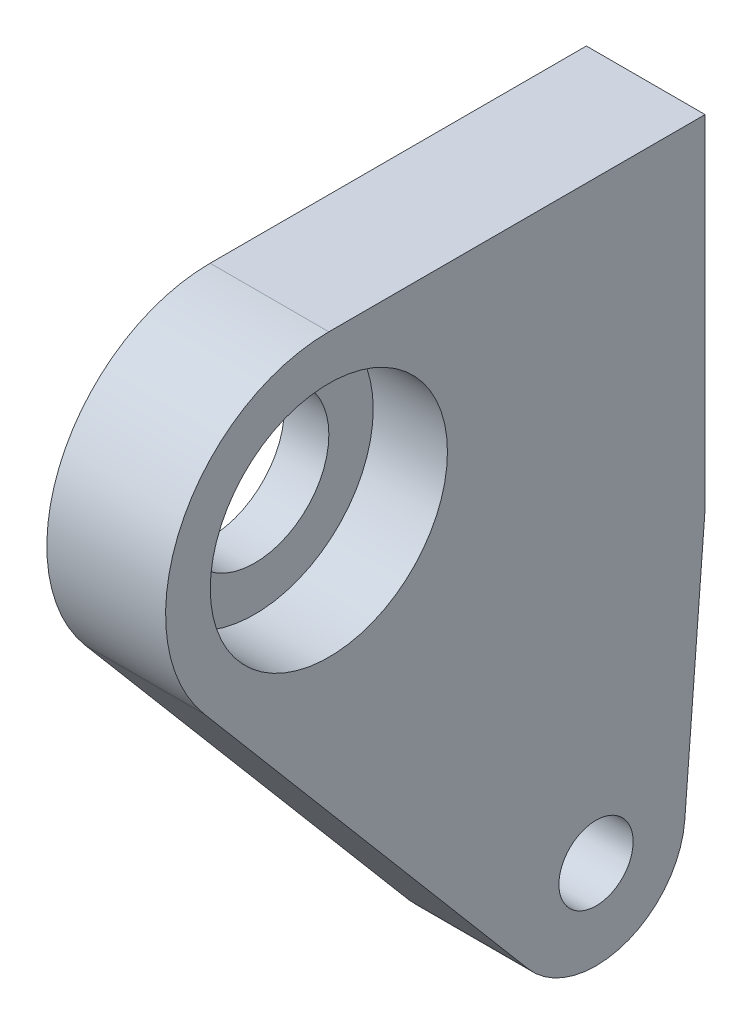
ISO-10303-21;
HEADER;
FILE_DESCRIPTION(('STEP AP214'),'2;1');
FILE_NAME('part.step','',(''),(''),'','','');
FILE_SCHEMA(('AUTOMOTIVE_DESIGN { 1 0 10303 214 1 1 1 1 }'));
ENDSEC;
DATA;
#1=APPLICATION_CONTEXT('core data for automotive mechanical design processes');
#2=APPLICATION_PROTOCOL_DEFINITION('international standard','automotive_design',2000,#1);
#3=PRODUCT_CONTEXT('',#1,'mechanical');
#4=PRODUCT('Part','Part','',(#3));
#5=PRODUCT_RELATED_PRODUCT_CATEGORY('part','',(#4));
#6=PRODUCT_DEFINITION_FORMATION('','',#4);
#7=PRODUCT_DEFINITION_CONTEXT('part definition',#1,'design');
#8=PRODUCT_DEFINITION('design','',#6,#7);
#9=PRODUCT_DEFINITION_SHAPE('','',#8);
#10=(LENGTH_UNIT() NAMED_UNIT(*) SI_UNIT(.MILLI.,.METRE.));
#11=(NAMED_UNIT(*) PLANE_ANGLE_UNIT() SI_UNIT($,.RADIAN.));
#12=(NAMED_UNIT(*) SI_UNIT($,.STERADIAN.) SOLID_ANGLE_UNIT());
#13=UNCERTAINTY_MEASURE_WITH_UNIT(LENGTH_MEASURE(1.E-05),#10,'distance_accuracy_value','');
#14=(GEOMETRIC_REPRESENTATION_CONTEXT(3) GLOBAL_UNCERTAINTY_ASSIGNED_CONTEXT((#13)) GLOBAL_UNIT_ASSIGNED_CONTEXT((#10,
#11,#12)) REPRESENTATION_CONTEXT('',''));
#15=CARTESIAN_POINT('',(0.,0.,0.));
#16=DIRECTION('',(0.,0.,1.));
#17=DIRECTION('',(1.,0.,0.));
#18=AXIS2_PLACEMENT_3D('',#15,#16,#17);
#19=CARTESIAN_POINT('',(8.,37.,-12.));
#20=DIRECTION('',(-1.,0.,0.));
#21=DIRECTION('',(0.,0.,1.));
#22=AXIS2_PLACEMENT_3D('',#19,#20,#21);
#23=CYLINDRICAL_SURFACE('',#22,5.);
#24=CARTESIAN_POINT('',(0.,37.,-12.));
#25=DIRECTION('',(1.,0.,0.));
#26=DIRECTION('',(0.,0.,-1.));
#27=AXIS2_PLACEMENT_3D('',#24,#25,#26);
#28=CIRCLE('',#27,5.);
#29=CARTESIAN_POINT('',(0.,37.,-17.));
#30=VERTEX_POINT('',#29);
#31=EDGE_CURVE('E128',#30,#30,#28,.T.);
#32=ORIENTED_EDGE('',*,*,#31,.F.);
#33=EDGE_LOOP('',(#32));
#34=FACE_BOUND('',#33,.T.);
#35=CARTESIAN_POINT('',(3.,37.,-12.));
#36=DIRECTION('',(1.,0.,0.));
#37=DIRECTION('',(0.,0.,-1.));
#38=AXIS2_PLACEMENT_3D('',#35,#36,#37);
#39=CIRCLE('',#38,5.);
#40=CARTESIAN_POINT('',(3.,37.,-17.));
#41=VERTEX_POINT('',#40);
#42=EDGE_CURVE('E38',#41,#41,#39,.T.);
#43=ORIENTED_EDGE('',*,*,#42,.T.);
#44=EDGE_LOOP('',(#43));
#45=FACE_BOUND('',#44,.T.);
#46=ADVANCED_FACE('F34',(#34,#45),#23,.F.);
#47=CARTESIAN_POINT('',(8.,37.,-12.));
#48=DIRECTION('',(1.,0.,0.));
#49=DIRECTION('',(0.,0.,-1.));
#50=AXIS2_PLACEMENT_3D('',#47,#48,#49);
#51=PLANE('',#50);
#52=CARTESIAN_POINT('',(8.,37.,-12.));
#53=DIRECTION('',(1.,0.,0.));
#54=DIRECTION('',(0.,0.,-1.));
#55=AXIS2_PLACEMENT_3D('',#52,#53,#54);
#56=CIRCLE('',#55,7.99);
#57=CARTESIAN_POINT('',(8.,37.,-19.99));
#58=VERTEX_POINT('',#57);
#59=EDGE_CURVE('E204',#58,#58,#56,.T.);
#60=ORIENTED_EDGE('',*,*,#59,.F.);
#61=EDGE_LOOP('',(#60));
#62=FACE_BOUND('',#61,.T.);
#63=CARTESIAN_POINT('',(8.,37.,-12.));
#64=DIRECTION('',(1.,0.,0.));
#65=DIRECTION('',(0.,0.,-1.));
#66=AXIS2_PLACEMENT_3D('',#63,#64,#65);
#67=CIRCLE('',#66,11.);
#68=CARTESIAN_POINT('',(8.,48.,-12.));
#69=VERTEX_POINT('',#68);
#70=CARTESIAN_POINT('',(8.,29.8924897558892,-3.60456682893255));
#71=VERTEX_POINT('',#70);
#72=EDGE_CURVE('E135',#69,#71,#67,.T.);
#73=ORIENTED_EDGE('',*,*,#72,.T.);
#74=DIRECTION('',(0.,-0.763221197369768,-0.646137294919166));
#75=VECTOR('',#74,1.);
#76=CARTESIAN_POINT('',(8.,29.8924897558892,-3.60456682893255));
#77=LINE('',#76,#75);
#78=CARTESIAN_POINT('',(8.,4.123176230485,-25.4206728157814));
#79=VERTEX_POINT('',#78);
#80=EDGE_CURVE('E90',#71,#79,#77,.T.);
#81=ORIENTED_EDGE('',*,*,#80,.T.);
#82=CARTESIAN_POINT('',(8.,8.,-30.));
#83=DIRECTION('',(1.,0.,0.));
#84=DIRECTION('',(0.,0.,1.));
#85=AXIS2_PLACEMENT_3D('',#82,#83,#84);
#86=CIRCLE('',#85,6.);
#87=CARTESIAN_POINT('',(8.,7.53167201393677,-35.9816944837955));
#88=VERTEX_POINT('',#87);
#89=EDGE_CURVE('E106',#79,#88,#86,.T.);
#90=ORIENTED_EDGE('',*,*,#89,.T.);
#91=DIRECTION('',(0.,0.996949080632589,-0.0780546643438713));
#92=VECTOR('',#91,1.);
#93=CARTESIAN_POINT('',(8.,25.,-37.3493515728975));
#94=LINE('',#93,#92);
#95=CARTESIAN_POINT('',(8.,25.,-37.3493515728975));
#96=VERTEX_POINT('',#95);
#97=EDGE_CURVE('E99',#88,#96,#94,.T.);
#98=ORIENTED_EDGE('',*,*,#97,.T.);
#99=DIRECTION('',(0.,1.,0.));
#100=VECTOR('',#99,1.);
#101=CARTESIAN_POINT('',(8.,48.,-37.3493515728975));
#102=LINE('',#101,#100);
#103=CARTESIAN_POINT('',(8.,48.,-37.3493515728975));
#104=VERTEX_POINT('',#103);
#105=EDGE_CURVE('E104',#96,#104,#102,.T.);
#106=ORIENTED_EDGE('',*,*,#105,.T.);
#107=DIRECTION('',(0.,0.,1.));
#108=VECTOR('',#107,1.);
#109=CARTESIAN_POINT('',(8.,48.,-12.));
#110=LINE('',#109,#108);
#111=EDGE_CURVE('E52',#104,#69,#110,.T.);
#112=ORIENTED_EDGE('',*,*,#111,.T.);
#113=EDGE_LOOP('',(#73,#81,#90,#98,#106,#112));
#114=FACE_BOUND('',#113,.T.);
#115=CARTESIAN_POINT('',(8.,8.,-30.));
#116=DIRECTION('',(1.,0.,0.));
#117=DIRECTION('',(0.,0.,-1.));
#118=AXIS2_PLACEMENT_3D('',#115,#116,#117);
#119=CIRCLE('',#118,2.5);
#120=CARTESIAN_POINT('',(8.,8.,-32.5));
#121=VERTEX_POINT('',#120);
#122=EDGE_CURVE('E182',#121,#121,#119,.T.);
#123=ORIENTED_EDGE('',*,*,#122,.F.);
#124=EDGE_LOOP('',(#123));
#125=FACE_BOUND('',#124,.T.);
#126=ADVANCED_FACE('F101',(#62,#114,#125),#51,.T.);
#127=CARTESIAN_POINT('',(0.,37.,-12.));
#128=DIRECTION('',(1.,0.,0.));
#129=DIRECTION('',(0.,0.,-1.));
#130=AXIS2_PLACEMENT_3D('',#127,#128,#129);
#131=PLANE('',#130);
#132=ORIENTED_EDGE('',*,*,#31,.T.);
#133=EDGE_LOOP('',(#132));
#134=FACE_BOUND('',#133,.T.);
#135=CARTESIAN_POINT('',(0.,37.,-12.));
#136=DIRECTION('',(1.,0.,0.));
#137=DIRECTION('',(0.,0.,-1.));
#138=AXIS2_PLACEMENT_3D('',#135,#136,#137);
#139=CIRCLE('',#138,11.);
#140=CARTESIAN_POINT('',(0.,48.,-12.));
#141=VERTEX_POINT('',#140);
#142=CARTESIAN_POINT('',(0.,29.8924897558892,-3.60456682893255));
#143=VERTEX_POINT('',#142);
#144=EDGE_CURVE('E124',#141,#143,#139,.T.);
#145=ORIENTED_EDGE('',*,*,#144,.F.);
#146=DIRECTION('',(0.,0.,1.));
#147=VECTOR('',#146,1.);
#148=CARTESIAN_POINT('',(0.,48.,-12.));
#149=LINE('',#148,#147);
#150=CARTESIAN_POINT('',(0.,48.,-37.3493515728975));
#151=VERTEX_POINT('',#150);
#152=EDGE_CURVE('E82',#151,#141,#149,.T.);
#153=ORIENTED_EDGE('',*,*,#152,.F.);
#154=DIRECTION('',(0.,1.,0.));
#155=VECTOR('',#154,1.);
#156=CARTESIAN_POINT('',(0.,48.,-37.3493515728975));
#157=LINE('',#156,#155);
#158=CARTESIAN_POINT('',(0.,25.,-37.3493515728975));
#159=VERTEX_POINT('',#158);
#160=EDGE_CURVE('E76',#159,#151,#157,.T.);
#161=ORIENTED_EDGE('',*,*,#160,.F.);
#162=DIRECTION('',(0.,0.996949080632589,-0.0780546643438713));
#163=VECTOR('',#162,1.);
#164=CARTESIAN_POINT('',(0.,25.,-37.3493515728975));
#165=LINE('',#164,#163);
#166=CARTESIAN_POINT('',(0.,7.53167201393677,-35.9816944837955));
#167=VERTEX_POINT('',#166);
#168=EDGE_CURVE('E114',#167,#159,#165,.T.);
#169=ORIENTED_EDGE('',*,*,#168,.F.);
#170=CARTESIAN_POINT('',(0.,8.,-30.));
#171=DIRECTION('',(1.,0.,0.));
#172=DIRECTION('',(0.,0.,1.));
#173=AXIS2_PLACEMENT_3D('',#170,#171,#172);
#174=CIRCLE('',#173,6.);
#175=CARTESIAN_POINT('',(0.,4.123176230485,-25.4206728157814));
#176=VERTEX_POINT('',#175);
#177=EDGE_CURVE('E130',#176,#167,#174,.T.);
#178=ORIENTED_EDGE('',*,*,#177,.F.);
#179=DIRECTION('',(0.,-0.763221197369768,-0.646137294919166));
#180=VECTOR('',#179,1.);
#181=CARTESIAN_POINT('',(0.,29.8924897558892,-3.60456682893255));
#182=LINE('',#181,#180);
#183=EDGE_CURVE('E127',#143,#176,#182,.T.);
#184=ORIENTED_EDGE('',*,*,#183,.F.);
#185=EDGE_LOOP('',(#145,#153,#161,#169,#178,#184));
#186=FACE_BOUND('',#185,.T.);
#187=CARTESIAN_POINT('',(0.,8.,-30.));
#188=DIRECTION('',(1.,0.,0.));
#189=DIRECTION('',(0.,0.,-1.));
#190=AXIS2_PLACEMENT_3D('',#187,#188,#189);
#191=CIRCLE('',#190,2.5);
#192=CARTESIAN_POINT('',(0.,8.,-32.5));
#193=VERTEX_POINT('',#192);
#194=EDGE_CURVE('E185',#193,#193,#191,.T.);
#195=ORIENTED_EDGE('',*,*,#194,.T.);
#196=EDGE_LOOP('',(#195));
#197=FACE_BOUND('',#196,.T.);
#198=ADVANCED_FACE('F145',(#134,#186,#197),#131,.F.);
#199=CARTESIAN_POINT('',(8.,37.,-12.));
#200=DIRECTION('',(-1.,0.,0.));
#201=DIRECTION('',(0.,0.,1.));
#202=AXIS2_PLACEMENT_3D('',#199,#200,#201);
#203=CYLINDRICAL_SURFACE('',#202,11.);
#204=ORIENTED_EDGE('',*,*,#144,.T.);
#205=DIRECTION('',(-1.,0.,0.));
#206=VECTOR('',#205,1.);
#207=CARTESIAN_POINT('',(8.,29.8924897558892,-3.60456682893255));
#208=LINE('',#207,#206);
#209=EDGE_CURVE('E11',#71,#143,#208,.T.);
#210=ORIENTED_EDGE('',*,*,#209,.F.);
#211=ORIENTED_EDGE('',*,*,#72,.F.);
#212=DIRECTION('',(-1.,0.,0.));
#213=VECTOR('',#212,1.);
#214=CARTESIAN_POINT('',(8.,48.,-12.));
#215=LINE('',#214,#213);
#216=EDGE_CURVE('E120',#69,#141,#215,.T.);
#217=ORIENTED_EDGE('',*,*,#216,.T.);
#218=EDGE_LOOP('',(#204,#210,#211,#217));
#219=FACE_BOUND('',#218,.T.);
#220=ADVANCED_FACE('F36',(#219),#203,.T.);
#221=CARTESIAN_POINT('',(8.,29.8924897558892,-3.60456682893255));
#222=DIRECTION('',(0.,0.646137294919166,-0.763221197369768));
#223=DIRECTION('',(0.,0.763221197369768,0.646137294919166));
#224=AXIS2_PLACEMENT_3D('',#221,#222,#223);
#225=PLANE('',#224);
#226=ORIENTED_EDGE('',*,*,#183,.T.);
#227=DIRECTION('',(-1.,0.,0.));
#228=VECTOR('',#227,1.);
#229=CARTESIAN_POINT('',(8.,4.123176230485,-25.4206728157814));
#230=LINE('',#229,#228);
#231=EDGE_CURVE('E44',#79,#176,#230,.T.);
#232=ORIENTED_EDGE('',*,*,#231,.F.);
#233=ORIENTED_EDGE('',*,*,#80,.F.);
#234=ORIENTED_EDGE('',*,*,#209,.T.);
#235=EDGE_LOOP('',(#226,#232,#233,#234));
#236=FACE_BOUND('',#235,.T.);
#237=ADVANCED_FACE('F180',(#236),#225,.F.);
#238=CARTESIAN_POINT('',(8.,8.,-30.));
#239=DIRECTION('',(-1.,0.,0.));
#240=DIRECTION('',(0.,0.,1.));
#241=AXIS2_PLACEMENT_3D('',#238,#239,#240);
#242=CYLINDRICAL_SURFACE('',#241,6.);
#243=ORIENTED_EDGE('',*,*,#177,.T.);
#244=DIRECTION('',(-1.,0.,0.));
#245=VECTOR('',#244,1.);
#246=CARTESIAN_POINT('',(8.,7.53167201393677,-35.9816944837955));
#247=LINE('',#246,#245);
#248=EDGE_CURVE('E115',#88,#167,#247,.T.);
#249=ORIENTED_EDGE('',*,*,#248,.F.);
#250=ORIENTED_EDGE('',*,*,#89,.F.);
#251=ORIENTED_EDGE('',*,*,#231,.T.);
#252=EDGE_LOOP('',(#243,#249,#250,#251));
#253=FACE_BOUND('',#252,.T.);
#254=ADVANCED_FACE('F142',(#253),#242,.T.);
#255=CARTESIAN_POINT('',(8.,25.,-37.3493515728975));
#256=DIRECTION('',(0.,0.0780546643438713,0.99694908063259));
#257=DIRECTION('',(0.,-0.99694908063259,0.0780546643438713));
#258=AXIS2_PLACEMENT_3D('',#255,#256,#257);
#259=PLANE('',#258);
#260=ORIENTED_EDGE('',*,*,#168,.T.);
#261=DIRECTION('',(-1.,0.,0.));
#262=VECTOR('',#261,1.);
#263=CARTESIAN_POINT('',(8.,25.,-37.3493515728975));
#264=LINE('',#263,#262);
#265=EDGE_CURVE('E111',#96,#159,#264,.T.);
#266=ORIENTED_EDGE('',*,*,#265,.F.);
#267=ORIENTED_EDGE('',*,*,#97,.F.);
#268=ORIENTED_EDGE('',*,*,#248,.T.);
#269=EDGE_LOOP('',(#260,#266,#267,#268));
#270=FACE_BOUND('',#269,.T.);
#271=ADVANCED_FACE('F112',(#270),#259,.F.);
#272=CARTESIAN_POINT('',(8.,48.,-37.3493515728975));
#273=DIRECTION('',(0.,0.,1.));
#274=DIRECTION('',(1.,0.,0.));
#275=AXIS2_PLACEMENT_3D('',#272,#273,#274);
#276=PLANE('',#275);
#277=CARTESIAN_POINT('',(3.,32.,-37.3493515728975));
#278=DIRECTION('',(0.,0.,-1.));
#279=DIRECTION('',(0.,1.,0.));
#280=AXIS2_PLACEMENT_3D('',#277,#278,#279);
#281=CIRCLE('',#280,1.24999999999999);
#282=CARTESIAN_POINT('',(3.,33.25,-37.3493515728975));
#283=VERTEX_POINT('',#282);
#284=EDGE_CURVE('E201',#283,#283,#281,.T.);
#285=ORIENTED_EDGE('',*,*,#284,.F.);
#286=EDGE_LOOP('',(#285));
#287=FACE_BOUND('',#286,.T.);
#288=CARTESIAN_POINT('',(3.,44.,-37.3493515728975));
#289=DIRECTION('',(0.,0.,-1.));
#290=DIRECTION('',(0.,1.,0.));
#291=AXIS2_PLACEMENT_3D('',#288,#289,#290);
#292=CIRCLE('',#291,1.24999999999999);
#293=CARTESIAN_POINT('',(3.,45.25,-37.3493515728975));
#294=VERTEX_POINT('',#293);
#295=EDGE_CURVE('E195',#294,#294,#292,.T.);
#296=ORIENTED_EDGE('',*,*,#295,.F.);
#297=EDGE_LOOP('',(#296));
#298=FACE_BOUND('',#297,.T.);
#299=ORIENTED_EDGE('',*,*,#160,.T.);
#300=DIRECTION('',(-1.,0.,0.));
#301=VECTOR('',#300,1.);
#302=CARTESIAN_POINT('',(8.,48.,-37.3493515728975));
#303=LINE('',#302,#301);
#304=EDGE_CURVE('E116',#104,#151,#303,.T.);
#305=ORIENTED_EDGE('',*,*,#304,.F.);
#306=ORIENTED_EDGE('',*,*,#105,.F.);
#307=ORIENTED_EDGE('',*,*,#265,.T.);
#308=EDGE_LOOP('',(#299,#305,#306,#307));
#309=FACE_BOUND('',#308,.T.);
#310=ADVANCED_FACE('F118',(#287,#298,#309),#276,.F.);
#311=CARTESIAN_POINT('',(8.,48.,-12.));
#312=DIRECTION('',(0.,-1.,0.));
#313=DIRECTION('',(0.,0.,-1.));
#314=AXIS2_PLACEMENT_3D('',#311,#312,#313);
#315=PLANE('',#314);
#316=ORIENTED_EDGE('',*,*,#152,.T.);
#317=ORIENTED_EDGE('',*,*,#216,.F.);
#318=ORIENTED_EDGE('',*,*,#111,.F.);
#319=ORIENTED_EDGE('',*,*,#304,.T.);
#320=EDGE_LOOP('',(#316,#317,#318,#319));
#321=FACE_BOUND('',#320,.T.);
#322=ADVANCED_FACE('F150',(#321),#315,.F.);
#323=CARTESIAN_POINT('',(8.,8.,-30.));
#324=DIRECTION('',(-1.,0.,0.));
#325=DIRECTION('',(0.,0.,1.));
#326=AXIS2_PLACEMENT_3D('',#323,#324,#325);
#327=CYLINDRICAL_SURFACE('',#326,2.5);
#328=ORIENTED_EDGE('',*,*,#122,.T.);
#329=EDGE_LOOP('',(#328));
#330=FACE_BOUND('',#329,.T.);
#331=ORIENTED_EDGE('',*,*,#194,.F.);
#332=EDGE_LOOP('',(#331));
#333=FACE_BOUND('',#332,.T.);
#334=ADVANCED_FACE('F152',(#330,#333),#327,.F.);
#335=CARTESIAN_POINT('',(3.,44.,-27.3493515728975));
#336=DIRECTION('',(0.,0.,-1.));
#337=DIRECTION('',(0.,1.,0.));
#338=AXIS2_PLACEMENT_3D('',#335,#336,#337);
#339=CONICAL_SURFACE('',#338,1.24999999999999,1.02974425867665);
#340=CARTESIAN_POINT('',(3.,44.,-26.598275799113));
#341=VERTEX_POINT('',#340);
#342=VERTEX_LOOP('',#341);
#343=FACE_BOUND('',#342,.T.);
#344=CARTESIAN_POINT('',(3.,44.,-27.3493515728975));
#345=DIRECTION('',(0.,0.,-1.));
#346=DIRECTION('',(0.,1.,0.));
#347=AXIS2_PLACEMENT_3D('',#344,#345,#346);
#348=CIRCLE('',#347,1.24999999999999);
#349=CARTESIAN_POINT('',(3.,45.25,-27.3493515728975));
#350=VERTEX_POINT('',#349);
#351=EDGE_CURVE('E191',#350,#350,#348,.T.);
#352=ORIENTED_EDGE('',*,*,#351,.T.);
#353=EDGE_LOOP('',(#352));
#354=FACE_BOUND('',#353,.T.);
#355=ADVANCED_FACE('F158',(#343,#354),#339,.F.);
#356=CARTESIAN_POINT('',(3.,44.,-37.3493515728975));
#357=DIRECTION('',(0.,0.,-1.));
#358=DIRECTION('',(0.,1.,0.));
#359=AXIS2_PLACEMENT_3D('',#356,#357,#358);
#360=CYLINDRICAL_SURFACE('',#359,1.24999999999999);
#361=ORIENTED_EDGE('',*,*,#351,.F.);
#362=EDGE_LOOP('',(#361));
#363=FACE_BOUND('',#362,.T.);
#364=ORIENTED_EDGE('',*,*,#295,.T.);
#365=EDGE_LOOP('',(#364));
#366=FACE_BOUND('',#365,.T.);
#367=ADVANCED_FACE('F231',(#363,#366),#360,.F.);
#368=CARTESIAN_POINT('',(3.,32.,-27.3493515728975));
#369=DIRECTION('',(0.,0.,-1.));
#370=DIRECTION('',(0.,1.,0.));
#371=AXIS2_PLACEMENT_3D('',#368,#369,#370);
#372=CONICAL_SURFACE('',#371,1.24999999999999,1.02974425867665);
#373=CARTESIAN_POINT('',(3.,32.,-26.598275799113));
#374=VERTEX_POINT('',#373);
#375=VERTEX_LOOP('',#374);
#376=FACE_BOUND('',#375,.T.);
#377=CARTESIAN_POINT('',(3.,32.,-27.3493515728975));
#378=DIRECTION('',(0.,0.,-1.));
#379=DIRECTION('',(0.,1.,0.));
#380=AXIS2_PLACEMENT_3D('',#377,#378,#379);
#381=CIRCLE('',#380,1.24999999999999);
#382=CARTESIAN_POINT('',(3.,33.25,-27.3493515728975));
#383=VERTEX_POINT('',#382);
#384=EDGE_CURVE('E198',#383,#383,#381,.T.);
#385=ORIENTED_EDGE('',*,*,#384,.T.);
#386=EDGE_LOOP('',(#385));
#387=FACE_BOUND('',#386,.T.);
#388=ADVANCED_FACE('F227',(#376,#387),#372,.F.);
#389=CARTESIAN_POINT('',(3.,32.,-37.3493515728975));
#390=DIRECTION('',(0.,0.,-1.));
#391=DIRECTION('',(0.,1.,0.));
#392=AXIS2_PLACEMENT_3D('',#389,#390,#391);
#393=CYLINDRICAL_SURFACE('',#392,1.24999999999999);
#394=ORIENTED_EDGE('',*,*,#384,.F.);
#395=EDGE_LOOP('',(#394));
#396=FACE_BOUND('',#395,.T.);
#397=ORIENTED_EDGE('',*,*,#284,.T.);
#398=EDGE_LOOP('',(#397));
#399=FACE_BOUND('',#398,.T.);
#400=ADVANCED_FACE('F221',(#396,#399),#393,.F.);
#401=CARTESIAN_POINT('',(3.,37.,-12.));
#402=DIRECTION('',(1.,0.,0.));
#403=DIRECTION('',(0.,0.,-1.));
#404=AXIS2_PLACEMENT_3D('',#401,#402,#403);
#405=CYLINDRICAL_SURFACE('',#404,7.99);
#406=CARTESIAN_POINT('',(3.,37.,-12.));
#407=DIRECTION('',(1.,0.,0.));
#408=DIRECTION('',(0.,0.,-1.));
#409=AXIS2_PLACEMENT_3D('',#406,#407,#408);
#410=CIRCLE('',#409,7.99);
#411=CARTESIAN_POINT('',(3.,37.,-19.99));
#412=VERTEX_POINT('',#411);
#413=EDGE_CURVE('E207',#412,#412,#410,.T.);
#414=ORIENTED_EDGE('',*,*,#413,.F.);
#415=EDGE_LOOP('',(#414));
#416=FACE_BOUND('',#415,.T.);
#417=ORIENTED_EDGE('',*,*,#59,.T.);
#418=EDGE_LOOP('',(#417));
#419=FACE_BOUND('',#418,.T.);
#420=ADVANCED_FACE('F216',(#416,#419),#405,.F.);
#421=CARTESIAN_POINT('',(3.,37.,-12.));
#422=DIRECTION('',(1.,0.,0.));
#423=DIRECTION('',(0.,0.,-1.));
#424=AXIS2_PLACEMENT_3D('',#421,#422,#423);
#425=PLANE('',#424);
#426=ORIENTED_EDGE('',*,*,#42,.F.);
#427=EDGE_LOOP('',(#426));
#428=FACE_BOUND('',#427,.T.);
#429=ORIENTED_EDGE('',*,*,#413,.T.);
#430=EDGE_LOOP('',(#429));
#431=FACE_BOUND('',#430,.T.);
#432=ADVANCED_FACE('F214',(#428,#431),#425,.T.);
#433=CLOSED_SHELL('',(#46,#126,#198,#220,#237,#254,#271,#310,#322,#334,#355,#367,#388,#400,#420,#432));
#434=MANIFOLD_SOLID_BREP('B2',#433);
#435=ADVANCED_BREP_SHAPE_REPRESENTATION('',(#18,#434),#14);
#436=SHAPE_DEFINITION_REPRESENTATION(#9,#435);
ENDSEC;
END-ISO-10303-21;
